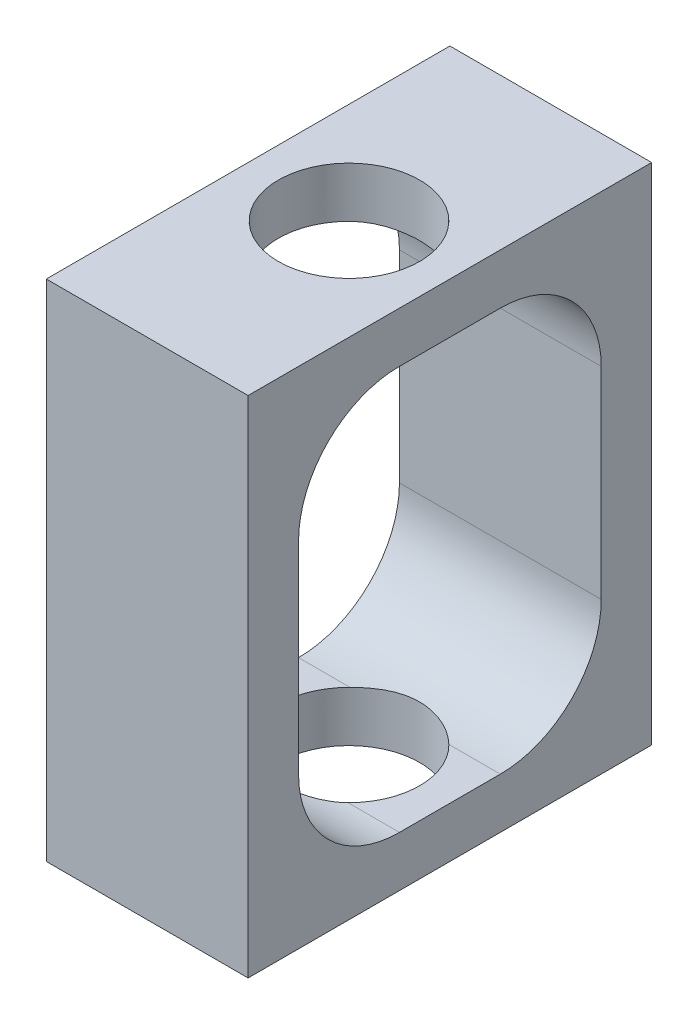
ISO-10303-21;
HEADER;
FILE_DESCRIPTION(('STEP AP214'),'2;1');
FILE_NAME('part.step','',(''),(''),'','','');
FILE_SCHEMA(('AUTOMOTIVE_DESIGN { 1 0 10303 214 1 1 1 1 }'));
ENDSEC;
DATA;
#1=APPLICATION_CONTEXT('core data for automotive mechanical design processes');
#2=APPLICATION_PROTOCOL_DEFINITION('international standard','automotive_design',2000,#1);
#3=PRODUCT_CONTEXT('',#1,'mechanical');
#4=PRODUCT('Part','Part','',(#3));
#5=PRODUCT_RELATED_PRODUCT_CATEGORY('part','',(#4));
#6=PRODUCT_DEFINITION_FORMATION('','',#4);
#7=PRODUCT_DEFINITION_CONTEXT('part definition',#1,'design');
#8=PRODUCT_DEFINITION('design','',#6,#7);
#9=PRODUCT_DEFINITION_SHAPE('','',#8);
#10=(LENGTH_UNIT() NAMED_UNIT(*) SI_UNIT(.MILLI.,.METRE.));
#11=(NAMED_UNIT(*) PLANE_ANGLE_UNIT() SI_UNIT($,.RADIAN.));
#12=(NAMED_UNIT(*) SI_UNIT($,.STERADIAN.) SOLID_ANGLE_UNIT());
#13=UNCERTAINTY_MEASURE_WITH_UNIT(LENGTH_MEASURE(1.E-05),#10,'distance_accuracy_value','');
#14=(GEOMETRIC_REPRESENTATION_CONTEXT(3) GLOBAL_UNCERTAINTY_ASSIGNED_CONTEXT((#13)) GLOBAL_UNIT_ASSIGNED_CONTEXT((#10,
#11,#12)) REPRESENTATION_CONTEXT('',''));
#15=CARTESIAN_POINT('',(0.,0.,0.));
#16=DIRECTION('',(0.,0.,1.));
#17=DIRECTION('',(1.,0.,0.));
#18=AXIS2_PLACEMENT_3D('',#15,#16,#17);
#19=CARTESIAN_POINT('',(10.,-20.,5.00000000000001));
#20=DIRECTION('',(0.,1.,0.));
#21=DIRECTION('',(0.,0.,1.));
#22=AXIS2_PLACEMENT_3D('',#19,#20,#21);
#23=PLANE('',#22);
#24=CARTESIAN_POINT('',(0.,-20.,0.));
#25=DIRECTION('',(0.,1.,0.));
#26=DIRECTION('',(0.,0.,1.));
#27=AXIS2_PLACEMENT_3D('',#24,#25,#26);
#28=CIRCLE('',#27,7.);
#29=CARTESIAN_POINT('',(4.89897948556635,-20.,5.00000000000001));
#30=VERTEX_POINT('',#29);
#31=CARTESIAN_POINT('',(4.89897948556635,-20.,-5.00000000000001));
#32=VERTEX_POINT('',#31);
#33=EDGE_CURVE('E54',#30,#32,#28,.T.);
#34=ORIENTED_EDGE('',*,*,#33,.F.);
#35=DIRECTION('',(-1.,0.,0.));
#36=VECTOR('',#35,1.);
#37=CARTESIAN_POINT('',(10.,-20.,5.00000000000001));
#38=LINE('',#37,#36);
#39=CARTESIAN_POINT('',(10.,-20.,5.00000000000001));
#40=VERTEX_POINT('',#39);
#41=EDGE_CURVE('E187',#40,#30,#38,.T.);
#42=ORIENTED_EDGE('',*,*,#41,.F.);
#43=DIRECTION('',(0.,0.,-1.));
#44=VECTOR('',#43,1.);
#45=CARTESIAN_POINT('',(10.,-20.,5.00000000000001));
#46=LINE('',#45,#44);
#47=CARTESIAN_POINT('',(10.,-20.,-5.00000000000001));
#48=VERTEX_POINT('',#47);
#49=EDGE_CURVE('E260',#40,#48,#46,.T.);
#50=ORIENTED_EDGE('',*,*,#49,.T.);
#51=DIRECTION('',(-1.,0.,0.));
#52=VECTOR('',#51,1.);
#53=CARTESIAN_POINT('',(10.,-20.,-5.00000000000001));
#54=LINE('',#53,#52);
#55=EDGE_CURVE('E183',#48,#32,#54,.T.);
#56=ORIENTED_EDGE('',*,*,#55,.T.);
#57=EDGE_LOOP('',(#34,#42,#50,#56));
#58=FACE_BOUND('',#57,.T.);
#59=ADVANCED_FACE('F39',(#58),#23,.T.);
#60=CARTESIAN_POINT('',(10.,20.,5.00000000000001));
#61=DIRECTION('',(0.,-1.,0.));
#62=DIRECTION('',(0.,0.,-1.));
#63=AXIS2_PLACEMENT_3D('',#60,#61,#62);
#64=PLANE('',#63);
#65=CARTESIAN_POINT('',(0.,20.,0.));
#66=DIRECTION('',(0.,-1.,0.));
#67=DIRECTION('',(0.,0.,-1.));
#68=AXIS2_PLACEMENT_3D('',#65,#66,#67);
#69=CIRCLE('',#68,7.);
#70=CARTESIAN_POINT('',(4.89897948556635,20.,-5.00000000000001));
#71=VERTEX_POINT('',#70);
#72=CARTESIAN_POINT('',(4.89897948556635,20.,5.00000000000001));
#73=VERTEX_POINT('',#72);
#74=EDGE_CURVE('E11',#71,#73,#69,.T.);
#75=ORIENTED_EDGE('',*,*,#74,.F.);
#76=DIRECTION('',(-1.,0.,0.));
#77=VECTOR('',#76,1.);
#78=CARTESIAN_POINT('',(10.,20.,-5.00000000000001));
#79=LINE('',#78,#77);
#80=CARTESIAN_POINT('',(10.,20.,-5.00000000000001));
#81=VERTEX_POINT('',#80);
#82=EDGE_CURVE('E164',#81,#71,#79,.T.);
#83=ORIENTED_EDGE('',*,*,#82,.F.);
#84=DIRECTION('',(0.,0.,1.));
#85=VECTOR('',#84,1.);
#86=CARTESIAN_POINT('',(10.,20.,5.00000000000001));
#87=LINE('',#86,#85);
#88=CARTESIAN_POINT('',(10.,20.,5.00000000000001));
#89=VERTEX_POINT('',#88);
#90=EDGE_CURVE('E272',#81,#89,#87,.T.);
#91=ORIENTED_EDGE('',*,*,#90,.T.);
#92=DIRECTION('',(-1.,0.,0.));
#93=VECTOR('',#92,1.);
#94=CARTESIAN_POINT('',(10.,20.,5.00000000000001));
#95=LINE('',#94,#93);
#96=EDGE_CURVE('E171',#89,#73,#95,.T.);
#97=ORIENTED_EDGE('',*,*,#96,.T.);
#98=EDGE_LOOP('',(#75,#83,#91,#97));
#99=FACE_BOUND('',#98,.T.);
#100=ADVANCED_FACE('F246',(#99),#64,.T.);
#101=CARTESIAN_POINT('',(10.,0.,0.));
#102=DIRECTION('',(1.,0.,0.));
#103=DIRECTION('',(0.,0.,-1.));
#104=AXIS2_PLACEMENT_3D('',#101,#102,#103);
#105=PLANE('',#104);
#106=DIRECTION('',(0.,1.,0.));
#107=VECTOR('',#106,1.);
#108=CARTESIAN_POINT('',(10.,25.,-20.));
#109=LINE('',#108,#107);
#110=CARTESIAN_POINT('',(10.,-25.,-20.));
#111=VERTEX_POINT('',#110);
#112=CARTESIAN_POINT('',(10.,25.,-20.));
#113=VERTEX_POINT('',#112);
#114=EDGE_CURVE('E196',#111,#113,#109,.T.);
#115=ORIENTED_EDGE('',*,*,#114,.T.);
#116=DIRECTION('',(0.,0.,1.));
#117=VECTOR('',#116,1.);
#118=CARTESIAN_POINT('',(10.,25.,20.));
#119=LINE('',#118,#117);
#120=CARTESIAN_POINT('',(10.,25.,20.));
#121=VERTEX_POINT('',#120);
#122=EDGE_CURVE('E199',#113,#121,#119,.T.);
#123=ORIENTED_EDGE('',*,*,#122,.T.);
#124=DIRECTION('',(0.,-1.,0.));
#125=VECTOR('',#124,1.);
#126=CARTESIAN_POINT('',(10.,25.,20.));
#127=LINE('',#126,#125);
#128=CARTESIAN_POINT('',(10.,-25.,20.));
#129=VERTEX_POINT('',#128);
#130=EDGE_CURVE('E202',#121,#129,#127,.T.);
#131=ORIENTED_EDGE('',*,*,#130,.T.);
#132=DIRECTION('',(0.,0.,-1.));
#133=VECTOR('',#132,1.);
#134=CARTESIAN_POINT('',(10.,-25.,20.));
#135=LINE('',#134,#133);
#136=EDGE_CURVE('E204',#129,#111,#135,.T.);
#137=ORIENTED_EDGE('',*,*,#136,.T.);
#138=EDGE_LOOP('',(#115,#123,#131,#137));
#139=FACE_BOUND('',#138,.T.);
#140=DIRECTION('',(0.,-1.,0.));
#141=VECTOR('',#140,1.);
#142=CARTESIAN_POINT('',(10.,9.99999999999999,15.));
#143=LINE('',#142,#141);
#144=CARTESIAN_POINT('',(10.,9.99999999999999,15.));
#145=VERTEX_POINT('',#144);
#146=CARTESIAN_POINT('',(10.,-10.,15.));
#147=VERTEX_POINT('',#146);
#148=EDGE_CURVE('E251',#145,#147,#143,.T.);
#149=ORIENTED_EDGE('',*,*,#148,.F.);
#150=CARTESIAN_POINT('',(10.,9.99999999999999,5.00000000000001));
#151=DIRECTION('',(1.,0.,0.));
#152=DIRECTION('',(0.,0.,-1.));
#153=AXIS2_PLACEMENT_3D('',#150,#151,#152);
#154=CIRCLE('',#153,10.);
#155=EDGE_CURVE('E253',#89,#145,#154,.T.);
#156=ORIENTED_EDGE('',*,*,#155,.F.);
#157=ORIENTED_EDGE('',*,*,#90,.F.);
#158=CARTESIAN_POINT('',(10.,9.99999999999999,-5.00000000000001));
#159=DIRECTION('',(1.,0.,0.));
#160=DIRECTION('',(0.,0.,1.));
#161=AXIS2_PLACEMENT_3D('',#158,#159,#160);
#162=CIRCLE('',#161,10.);
#163=CARTESIAN_POINT('',(10.,9.99999999999999,-15.));
#164=VERTEX_POINT('',#163);
#165=EDGE_CURVE('E270',#164,#81,#162,.T.);
#166=ORIENTED_EDGE('',*,*,#165,.F.);
#167=DIRECTION('',(0.,1.,0.));
#168=VECTOR('',#167,1.);
#169=CARTESIAN_POINT('',(10.,9.99999999999999,-15.));
#170=LINE('',#169,#168);
#171=CARTESIAN_POINT('',(10.,-10.,-15.));
#172=VERTEX_POINT('',#171);
#173=EDGE_CURVE('E268',#172,#164,#170,.T.);
#174=ORIENTED_EDGE('',*,*,#173,.F.);
#175=CARTESIAN_POINT('',(10.,-10.,-5.00000000000001));
#176=DIRECTION('',(1.,0.,0.));
#177=DIRECTION('',(0.,0.,-1.));
#178=AXIS2_PLACEMENT_3D('',#175,#176,#177);
#179=CIRCLE('',#178,10.);
#180=EDGE_CURVE('E266',#48,#172,#179,.T.);
#181=ORIENTED_EDGE('',*,*,#180,.F.);
#182=ORIENTED_EDGE('',*,*,#49,.F.);
#183=CARTESIAN_POINT('',(10.,-10.,5.00000000000001));
#184=DIRECTION('',(1.,0.,0.));
#185=DIRECTION('',(0.,0.,-1.));
#186=AXIS2_PLACEMENT_3D('',#183,#184,#185);
#187=CIRCLE('',#186,10.);
#188=EDGE_CURVE('E255',#147,#40,#187,.T.);
#189=ORIENTED_EDGE('',*,*,#188,.F.);
#190=EDGE_LOOP('',(#149,#156,#157,#166,#174,#181,#182,#189));
#191=FACE_BOUND('',#190,.T.);
#192=ADVANCED_FACE('F243',(#139,#191),#105,.T.);
#193=CARTESIAN_POINT('',(-10.,0.,0.));
#194=DIRECTION('',(1.,0.,0.));
#195=DIRECTION('',(0.,0.,-1.));
#196=AXIS2_PLACEMENT_3D('',#193,#194,#195);
#197=PLANE('',#196);
#198=DIRECTION('',(0.,1.,0.));
#199=VECTOR('',#198,1.);
#200=CARTESIAN_POINT('',(-10.,25.,-20.));
#201=LINE('',#200,#199);
#202=CARTESIAN_POINT('',(-10.,-25.,-20.));
#203=VERTEX_POINT('',#202);
#204=CARTESIAN_POINT('',(-10.,25.,-20.));
#205=VERTEX_POINT('',#204);
#206=EDGE_CURVE('E195',#203,#205,#201,.T.);
#207=ORIENTED_EDGE('',*,*,#206,.F.);
#208=DIRECTION('',(0.,0.,-1.));
#209=VECTOR('',#208,1.);
#210=CARTESIAN_POINT('',(-10.,-25.,20.));
#211=LINE('',#210,#209);
#212=CARTESIAN_POINT('',(-10.,-25.,20.));
#213=VERTEX_POINT('',#212);
#214=EDGE_CURVE('E200',#213,#203,#211,.T.);
#215=ORIENTED_EDGE('',*,*,#214,.F.);
#216=DIRECTION('',(0.,-1.,0.));
#217=VECTOR('',#216,1.);
#218=CARTESIAN_POINT('',(-10.,25.,20.));
#219=LINE('',#218,#217);
#220=CARTESIAN_POINT('',(-10.,25.,20.));
#221=VERTEX_POINT('',#220);
#222=EDGE_CURVE('E211',#221,#213,#219,.T.);
#223=ORIENTED_EDGE('',*,*,#222,.F.);
#224=DIRECTION('',(0.,0.,1.));
#225=VECTOR('',#224,1.);
#226=CARTESIAN_POINT('',(-10.,25.,20.));
#227=LINE('',#226,#225);
#228=EDGE_CURVE('E209',#205,#221,#227,.T.);
#229=ORIENTED_EDGE('',*,*,#228,.F.);
#230=EDGE_LOOP('',(#207,#215,#223,#229));
#231=FACE_BOUND('',#230,.T.);
#232=CARTESIAN_POINT('',(-10.,9.99999999999999,5.00000000000001));
#233=DIRECTION('',(1.,0.,0.));
#234=DIRECTION('',(0.,0.,-1.));
#235=AXIS2_PLACEMENT_3D('',#232,#233,#234);
#236=CIRCLE('',#235,10.);
#237=CARTESIAN_POINT('',(-10.,20.,5.00000000000001));
#238=VERTEX_POINT('',#237);
#239=CARTESIAN_POINT('',(-10.,9.99999999999999,15.));
#240=VERTEX_POINT('',#239);
#241=EDGE_CURVE('E274',#238,#240,#236,.T.);
#242=ORIENTED_EDGE('',*,*,#241,.T.);
#243=DIRECTION('',(0.,-1.,0.));
#244=VECTOR('',#243,1.);
#245=CARTESIAN_POINT('',(-10.,9.99999999999999,15.));
#246=LINE('',#245,#244);
#247=CARTESIAN_POINT('',(-10.,-10.,15.));
#248=VERTEX_POINT('',#247);
#249=EDGE_CURVE('E277',#240,#248,#246,.T.);
#250=ORIENTED_EDGE('',*,*,#249,.T.);
#251=CARTESIAN_POINT('',(-10.,-10.,5.00000000000001));
#252=DIRECTION('',(1.,0.,0.));
#253=DIRECTION('',(0.,0.,-1.));
#254=AXIS2_PLACEMENT_3D('',#251,#252,#253);
#255=CIRCLE('',#254,10.);
#256=CARTESIAN_POINT('',(-10.,-20.,5.00000000000001));
#257=VERTEX_POINT('',#256);
#258=EDGE_CURVE('E281',#248,#257,#255,.T.);
#259=ORIENTED_EDGE('',*,*,#258,.T.);
#260=DIRECTION('',(0.,0.,-1.));
#261=VECTOR('',#260,1.);
#262=CARTESIAN_POINT('',(-10.,-20.,5.00000000000001));
#263=LINE('',#262,#261);
#264=CARTESIAN_POINT('',(-10.,-20.,-5.00000000000001));
#265=VERTEX_POINT('',#264);
#266=EDGE_CURVE('E284',#257,#265,#263,.T.);
#267=ORIENTED_EDGE('',*,*,#266,.T.);
#268=CARTESIAN_POINT('',(-10.,-10.,-5.00000000000001));
#269=DIRECTION('',(1.,0.,0.));
#270=DIRECTION('',(0.,0.,-1.));
#271=AXIS2_PLACEMENT_3D('',#268,#269,#270);
#272=CIRCLE('',#271,10.);
#273=CARTESIAN_POINT('',(-10.,-10.,-15.));
#274=VERTEX_POINT('',#273);
#275=EDGE_CURVE('E287',#265,#274,#272,.T.);
#276=ORIENTED_EDGE('',*,*,#275,.T.);
#277=DIRECTION('',(0.,1.,0.));
#278=VECTOR('',#277,1.);
#279=CARTESIAN_POINT('',(-10.,9.99999999999999,-15.));
#280=LINE('',#279,#278);
#281=CARTESIAN_POINT('',(-10.,9.99999999999999,-15.));
#282=VERTEX_POINT('',#281);
#283=EDGE_CURVE('E290',#274,#282,#280,.T.);
#284=ORIENTED_EDGE('',*,*,#283,.T.);
#285=CARTESIAN_POINT('',(-10.,9.99999999999999,-5.00000000000001));
#286=DIRECTION('',(1.,0.,0.));
#287=DIRECTION('',(0.,0.,1.));
#288=AXIS2_PLACEMENT_3D('',#285,#286,#287);
#289=CIRCLE('',#288,10.);
#290=CARTESIAN_POINT('',(-10.,20.,-5.00000000000001));
#291=VERTEX_POINT('',#290);
#292=EDGE_CURVE('E293',#282,#291,#289,.T.);
#293=ORIENTED_EDGE('',*,*,#292,.T.);
#294=DIRECTION('',(0.,0.,1.));
#295=VECTOR('',#294,1.);
#296=CARTESIAN_POINT('',(-10.,20.,5.00000000000001));
#297=LINE('',#296,#295);
#298=EDGE_CURVE('E169',#291,#238,#297,.T.);
#299=ORIENTED_EDGE('',*,*,#298,.T.);
#300=EDGE_LOOP('',(#242,#250,#259,#267,#276,#284,#293,#299));
#301=FACE_BOUND('',#300,.T.);
#302=ADVANCED_FACE('F232',(#231,#301),#197,.F.);
#303=CARTESIAN_POINT('',(10.,25.,-20.));
#304=DIRECTION('',(0.,0.,1.));
#305=DIRECTION('',(1.,0.,0.));
#306=AXIS2_PLACEMENT_3D('',#303,#304,#305);
#307=PLANE('',#306);
#308=ORIENTED_EDGE('',*,*,#206,.T.);
#309=DIRECTION('',(-1.,0.,0.));
#310=VECTOR('',#309,1.);
#311=CARTESIAN_POINT('',(10.,25.,-20.));
#312=LINE('',#311,#310);
#313=EDGE_CURVE('E156',#113,#205,#312,.T.);
#314=ORIENTED_EDGE('',*,*,#313,.F.);
#315=ORIENTED_EDGE('',*,*,#114,.F.);
#316=DIRECTION('',(-1.,0.,0.));
#317=VECTOR('',#316,1.);
#318=CARTESIAN_POINT('',(10.,-25.,-20.));
#319=LINE('',#318,#317);
#320=EDGE_CURVE('E206',#111,#203,#319,.T.);
#321=ORIENTED_EDGE('',*,*,#320,.T.);
#322=EDGE_LOOP('',(#308,#314,#315,#321));
#323=FACE_BOUND('',#322,.T.);
#324=ADVANCED_FACE('F41',(#323),#307,.F.);
#325=CARTESIAN_POINT('',(10.,25.,20.));
#326=DIRECTION('',(0.,-1.,0.));
#327=DIRECTION('',(0.,0.,-1.));
#328=AXIS2_PLACEMENT_3D('',#325,#326,#327);
#329=PLANE('',#328);
#330=CARTESIAN_POINT('',(0.,25.,0.));
#331=DIRECTION('',(0.,1.,0.));
#332=DIRECTION('',(0.,0.,1.));
#333=AXIS2_PLACEMENT_3D('',#330,#331,#332);
#334=CIRCLE('',#333,7.);
#335=CARTESIAN_POINT('',(0.,25.,7.));
#336=VERTEX_POINT('',#335);
#337=EDGE_CURVE('E496',#336,#336,#334,.T.);
#338=ORIENTED_EDGE('',*,*,#337,.F.);
#339=EDGE_LOOP('',(#338));
#340=FACE_BOUND('',#339,.T.);
#341=ORIENTED_EDGE('',*,*,#228,.T.);
#342=DIRECTION('',(-1.,0.,0.));
#343=VECTOR('',#342,1.);
#344=CARTESIAN_POINT('',(10.,25.,20.));
#345=LINE('',#344,#343);
#346=EDGE_CURVE('E219',#121,#221,#345,.T.);
#347=ORIENTED_EDGE('',*,*,#346,.F.);
#348=ORIENTED_EDGE('',*,*,#122,.F.);
#349=ORIENTED_EDGE('',*,*,#313,.T.);
#350=EDGE_LOOP('',(#341,#347,#348,#349));
#351=FACE_BOUND('',#350,.T.);
#352=ADVANCED_FACE('F224',(#340,#351),#329,.F.);
#353=CARTESIAN_POINT('',(10.,25.,20.));
#354=DIRECTION('',(0.,0.,-1.));
#355=DIRECTION('',(-1.,0.,0.));
#356=AXIS2_PLACEMENT_3D('',#353,#354,#355);
#357=PLANE('',#356);
#358=ORIENTED_EDGE('',*,*,#222,.T.);
#359=DIRECTION('',(-1.,0.,0.));
#360=VECTOR('',#359,1.);
#361=CARTESIAN_POINT('',(10.,-25.,20.));
#362=LINE('',#361,#360);
#363=EDGE_CURVE('E216',#129,#213,#362,.T.);
#364=ORIENTED_EDGE('',*,*,#363,.F.);
#365=ORIENTED_EDGE('',*,*,#130,.F.);
#366=ORIENTED_EDGE('',*,*,#346,.T.);
#367=EDGE_LOOP('',(#358,#364,#365,#366));
#368=FACE_BOUND('',#367,.T.);
#369=ADVANCED_FACE('F237',(#368),#357,.F.);
#370=CARTESIAN_POINT('',(10.,-25.,20.));
#371=DIRECTION('',(0.,1.,0.));
#372=DIRECTION('',(0.,0.,1.));
#373=AXIS2_PLACEMENT_3D('',#370,#371,#372);
#374=PLANE('',#373);
#375=CARTESIAN_POINT('',(0.,-25.,0.));
#376=DIRECTION('',(0.,1.,0.));
#377=DIRECTION('',(0.,0.,1.));
#378=AXIS2_PLACEMENT_3D('',#375,#376,#377);
#379=CIRCLE('',#378,7.);
#380=CARTESIAN_POINT('',(0.,-25.,7.));
#381=VERTEX_POINT('',#380);
#382=EDGE_CURVE('E165',#381,#381,#379,.T.);
#383=ORIENTED_EDGE('',*,*,#382,.T.);
#384=EDGE_LOOP('',(#383));
#385=FACE_BOUND('',#384,.T.);
#386=ORIENTED_EDGE('',*,*,#214,.T.);
#387=ORIENTED_EDGE('',*,*,#320,.F.);
#388=ORIENTED_EDGE('',*,*,#136,.F.);
#389=ORIENTED_EDGE('',*,*,#363,.T.);
#390=EDGE_LOOP('',(#386,#387,#388,#389));
#391=FACE_BOUND('',#390,.T.);
#392=ADVANCED_FACE('F241',(#385,#391),#374,.F.);
#393=CARTESIAN_POINT('',(10.,9.99999999999999,5.00000000000001));
#394=DIRECTION('',(-1.,0.,0.));
#395=DIRECTION('',(0.,0.,1.));
#396=AXIS2_PLACEMENT_3D('',#393,#394,#395);
#397=CYLINDRICAL_SURFACE('',#396,10.);
#398=CARTESIAN_POINT('',(4.89897948556635,20.,5.00000000000001));
#399=CARTESIAN_POINT('',(4.75906144843106,19.99999564988,5.1371228849399));
#400=CARTESIAN_POINT('',(4.61338560174563,19.997179190797,5.26831139777291));
#401=CARTESIAN_POINT('',(4.31169068672161,19.9873604279464,5.51793045499645));
#402=CARTESIAN_POINT('',(4.15567504744615,19.9803595057886,5.63636519515231));
#403=CARTESIAN_POINT('',(3.83444919495901,19.9636119442593,5.8596303935024));
#404=CARTESIAN_POINT('',(3.66924302224488,19.9538665039427,5.96446676355123));
#405=CARTESIAN_POINT('',(3.33069652724321,19.9329875656152,6.15992379032135));
#406=CARTESIAN_POINT('',(3.15735565596276,19.9218539738368,6.25054348579296));
#407=CARTESIAN_POINT('',(2.80376648519738,19.8994617260947,6.41693545917038));
#408=CARTESIAN_POINT('',(2.62352046521201,19.8882031122597,6.49271258720027));
#409=CARTESIAN_POINT('',(2.25727121615959,19.8666762832176,6.62894403698854));
#410=CARTESIAN_POINT('',(2.07126806434578,19.8564080547285,6.68939856425645));
#411=CARTESIAN_POINT('',(1.69484515057814,19.8378100258575,6.7945322891914));
#412=CARTESIAN_POINT('',(1.50442734505007,19.8294793842008,6.83921833770073));
#413=CARTESIAN_POINT('',(1.12042405324723,19.8154818263267,6.91251446718161));
#414=CARTESIAN_POINT('',(0.926838584911666,19.8098148950296,6.94112463916217));
#415=CARTESIAN_POINT('',(0.537454704692252,19.8016206456619,6.98208782577597));
#416=CARTESIAN_POINT('',(0.341652353236317,19.7991002808995,6.99440483921785));
#417=CARTESIAN_POINT('',(-0.0503114344762466,19.797436268489,7.00256342069674));
#418=CARTESIAN_POINT('',(-0.246472873343679,19.7982926454902,6.9984048684661));
#419=CARTESIAN_POINT('',(-0.637783649184534,19.8033104677283,6.97364188238686));
#420=CARTESIAN_POINT('',(-0.832932585943366,19.8074731325314,6.9530313800134));
#421=CARTESIAN_POINT('',(-1.22072326670553,19.8187495882788,6.89552441612888));
#422=CARTESIAN_POINT('',(-1.41336506021876,19.8258633208552,6.85862827672293));
#423=CARTESIAN_POINT('',(-1.79217631701503,19.8423102121072,6.76944978183305));
#424=CARTESIAN_POINT('',(-1.9783982077305,19.8516118024561,6.7173839676316));
#425=CARTESIAN_POINT('',(-2.34583652108035,19.871669992267,6.59805797061007));
#426=CARTESIAN_POINT('',(-2.52705264283568,19.8824266789617,6.53079687667614));
#427=CARTESIAN_POINT('',(-2.88316369111359,19.9043881809011,6.38158320011455));
#428=CARTESIAN_POINT('',(-3.0580628543198,19.9155926847634,6.29964069250342));
#429=CARTESIAN_POINT('',(-3.40046815794824,19.9373054146031,6.12160631232607));
#430=CARTESIAN_POINT('',(-3.56797608584314,19.9478138092368,6.02551788540997));
#431=CARTESIAN_POINT('',(-3.94150438064145,19.9696185849698,5.79018104329629));
#432=CARTESIAN_POINT('',(-4.14478352726645,19.9802758406701,5.64645975953044));
#433=CARTESIAN_POINT('',(-4.4372893134706,19.9916681414418,5.41534112816267));
#434=CARTESIAN_POINT('',(-4.53269204248663,19.9946997266151,5.33574188165284));
#435=CARTESIAN_POINT('',(-4.71915365701482,19.9988654085679,5.17155801661657));
#436=CARTESIAN_POINT('',(-4.81021241765271,19.9999994508315,5.08697325492965));
#437=CARTESIAN_POINT('',(-4.89897948556635,20.,5.00000000000001));
#438=B_SPLINE_CURVE_WITH_KNOTS('',3,(#398,#399,#400,#401,#402,#403,#404,#405,#406,#407,#408,
#409,#410,#411,#412,#413,#414,#415,#416,#417,#418,#419,#420,#421,#422,#423,#424,#425,#426,#427,
#428,#429,#430,#431,#432,#433,#434,#435,#436,#437),.UNSPECIFIED.,.F.,.F.,(4,2,2,2,2,2,2,2,2,2,2,
2,2,2,2,2,2,2,2,4),(0.,0.587471530871945,1.17474919974625,1.76177068933847,2.34883185285334,
2.9357008604523,3.52256199643987,4.10916784733234,4.6957703772887,5.28366690490185,
5.87156772402522,6.45968549860084,7.04779164162328,7.62788287713043,8.20800890433029,
8.78773833841841,9.36732679546515,10.1132252552326,10.4859207388046,10.8586269296513),.UNSPECIFIED.);
#439=CARTESIAN_POINT('',(-4.89897948556635,20.,5.00000000000001));
#440=VERTEX_POINT('',#439);
#441=EDGE_CURVE('E61',#73,#440,#438,.T.);
#442=ORIENTED_EDGE('',*,*,#441,.F.);
#443=ORIENTED_EDGE('',*,*,#96,.F.);
#444=ORIENTED_EDGE('',*,*,#155,.T.);
#445=DIRECTION('',(-1.,0.,0.));
#446=VECTOR('',#445,1.);
#447=CARTESIAN_POINT('',(10.,9.99999999999999,15.));
#448=LINE('',#447,#446);
#449=EDGE_CURVE('E192',#145,#240,#448,.T.);
#450=ORIENTED_EDGE('',*,*,#449,.T.);
#451=ORIENTED_EDGE('',*,*,#241,.F.);
#452=EDGE_CURVE('E175',#440,#238,#95,.T.);
#453=ORIENTED_EDGE('',*,*,#452,.F.);
#454=EDGE_LOOP('',(#442,#443,#444,#450,#451,#453));
#455=FACE_BOUND('',#454,.T.);
#456=ADVANCED_FACE('F304',(#455),#397,.F.);
#457=CARTESIAN_POINT('',(10.,9.99999999999999,15.));
#458=DIRECTION('',(0.,0.,-1.));
#459=DIRECTION('',(-1.,0.,0.));
#460=AXIS2_PLACEMENT_3D('',#457,#458,#459);
#461=PLANE('',#460);
#462=ORIENTED_EDGE('',*,*,#249,.F.);
#463=ORIENTED_EDGE('',*,*,#449,.F.);
#464=ORIENTED_EDGE('',*,*,#148,.T.);
#465=DIRECTION('',(-1.,0.,0.));
#466=VECTOR('',#465,1.);
#467=CARTESIAN_POINT('',(10.,-10.,15.));
#468=LINE('',#467,#466);
#469=EDGE_CURVE('E190',#147,#248,#468,.T.);
#470=ORIENTED_EDGE('',*,*,#469,.T.);
#471=EDGE_LOOP('',(#462,#463,#464,#470));
#472=FACE_BOUND('',#471,.T.);
#473=ADVANCED_FACE('F346',(#472),#461,.T.);
#474=CARTESIAN_POINT('',(10.,-10.,5.00000000000001));
#475=DIRECTION('',(-1.,0.,0.));
#476=DIRECTION('',(0.,0.,1.));
#477=AXIS2_PLACEMENT_3D('',#474,#475,#476);
#478=CYLINDRICAL_SURFACE('',#477,10.);
#479=CARTESIAN_POINT('',(-4.89897948556635,-20.,5.));
#480=CARTESIAN_POINT('',(-4.75906144843106,-19.99999564988,5.13712288493989));
#481=CARTESIAN_POINT('',(-4.61338560174563,-19.997179190797,5.26831139777291));
#482=CARTESIAN_POINT('',(-4.31169068672161,-19.9873604279464,5.51793045499645));
#483=CARTESIAN_POINT('',(-4.15567504744615,-19.9803595057886,5.63636519515231));
#484=CARTESIAN_POINT('',(-3.83444919495902,-19.9636119442593,5.85963039350239));
#485=CARTESIAN_POINT('',(-3.66924302224488,-19.9538665039427,5.96446676355122));
#486=CARTESIAN_POINT('',(-3.33069652724322,-19.9329875656152,6.15992379032135));
#487=CARTESIAN_POINT('',(-3.15735565596277,-19.9218539738368,6.25054348579296));
#488=CARTESIAN_POINT('',(-2.80376648519738,-19.8994617260947,6.41693545917038));
#489=CARTESIAN_POINT('',(-2.62352046521202,-19.8882031122597,6.49271258720027));
#490=CARTESIAN_POINT('',(-2.25727121615959,-19.8666762832176,6.62894403698854));
#491=CARTESIAN_POINT('',(-2.07126806434579,-19.8564080547285,6.68939856425645));
#492=CARTESIAN_POINT('',(-1.69484515057815,-19.8378100258575,6.7945322891914));
#493=CARTESIAN_POINT('',(-1.50442734505008,-19.8294793842008,6.83921833770073));
#494=CARTESIAN_POINT('',(-1.12042405324724,-19.8154818263267,6.91251446718161));
#495=CARTESIAN_POINT('',(-0.926838584911671,-19.8098148950296,6.94112463916217));
#496=CARTESIAN_POINT('',(-0.537454704692257,-19.8016206456619,6.98208782577597));
#497=CARTESIAN_POINT('',(-0.341652353236323,-19.7991002808995,6.99440483921785));
#498=CARTESIAN_POINT('',(0.050311434476241,-19.797436268489,7.00256342069674));
#499=CARTESIAN_POINT('',(0.246472873343673,-19.7982926454902,6.9984048684661));
#500=CARTESIAN_POINT('',(0.637783649184529,-19.8033104677283,6.97364188238687));
#501=CARTESIAN_POINT('',(0.832932585943361,-19.8074731325314,6.9530313800134));
#502=CARTESIAN_POINT('',(1.22072326670552,-19.8187495882788,6.89552441612888));
#503=CARTESIAN_POINT('',(1.41336506021875,-19.8258633208552,6.85862827672293));
#504=CARTESIAN_POINT('',(1.79217631701502,-19.8423102121072,6.76944978183305));
#505=CARTESIAN_POINT('',(1.9783982077305,-19.8516118024561,6.7173839676316));
#506=CARTESIAN_POINT('',(2.34583652108034,-19.871669992267,6.59805797061007));
#507=CARTESIAN_POINT('',(2.52705264283568,-19.8824266789617,6.53079687667614));
#508=CARTESIAN_POINT('',(2.88316369111358,-19.9043881809011,6.38158320011456));
#509=CARTESIAN_POINT('',(3.05806285431979,-19.9155926847634,6.29964069250342));
#510=CARTESIAN_POINT('',(3.40046815794824,-19.9373054146031,6.12160631232607));
#511=CARTESIAN_POINT('',(3.56797608584314,-19.9478138092368,6.02551788540997));
#512=CARTESIAN_POINT('',(3.94150438064145,-19.9696185849698,5.7901810432963));
#513=CARTESIAN_POINT('',(4.14478352726644,-19.9802758406701,5.64645975953044));
#514=CARTESIAN_POINT('',(4.4372893134706,-19.9916681414418,5.41534112816267));
#515=CARTESIAN_POINT('',(4.53269204248663,-19.9946997266151,5.33574188165284));
#516=CARTESIAN_POINT('',(4.71915365701482,-19.9988654085679,5.17155801661657));
#517=CARTESIAN_POINT('',(4.81021241765272,-19.9999994508315,5.08697325492965));
#518=CARTESIAN_POINT('',(4.89897948556635,-20.,5.));
#519=B_SPLINE_CURVE_WITH_KNOTS('',3,(#479,#480,#481,#482,#483,#484,#485,#486,#487,#488,#489,
#490,#491,#492,#493,#494,#495,#496,#497,#498,#499,#500,#501,#502,#503,#504,#505,#506,#507,#508,
#509,#510,#511,#512,#513,#514,#515,#516,#517,#518),.UNSPECIFIED.,.F.,.F.,(4,2,2,2,2,2,2,2,2,2,2,
2,2,2,2,2,2,2,2,4),(0.,0.587471530871945,1.17474919974625,1.76177068933847,2.34883185285333,
2.9357008604523,3.52256199643987,4.10916784733234,4.69577037728869,5.28366690490184,
5.87156772402522,6.45968549860084,7.04779164162327,7.62788287713042,8.20800890433028,
8.7877383384184,9.36732679546515,10.1132252552326,10.4859207388046,10.8586269296513),.UNSPECIFIED.);
#520=CARTESIAN_POINT('',(-4.89897948556635,-20.,5.00000000000001));
#521=VERTEX_POINT('',#520);
#522=EDGE_CURVE('E278',#521,#30,#519,.T.);
#523=ORIENTED_EDGE('',*,*,#522,.F.);
#524=EDGE_CURVE('E186',#521,#257,#38,.T.);
#525=ORIENTED_EDGE('',*,*,#524,.T.);
#526=ORIENTED_EDGE('',*,*,#258,.F.);
#527=ORIENTED_EDGE('',*,*,#469,.F.);
#528=ORIENTED_EDGE('',*,*,#188,.T.);
#529=ORIENTED_EDGE('',*,*,#41,.T.);
#530=EDGE_LOOP('',(#523,#525,#526,#527,#528,#529));
#531=FACE_BOUND('',#530,.T.);
#532=ADVANCED_FACE('F341',(#531),#478,.F.);
#533=CARTESIAN_POINT('',(-4.89897948556635,-20.,-5.00000000000001));
#534=VERTEX_POINT('',#533);
#535=EDGE_CURVE('E307',#534,#521,#28,.T.);
#536=ORIENTED_EDGE('',*,*,#535,.F.);
#537=EDGE_CURVE('E182',#534,#265,#54,.T.);
#538=ORIENTED_EDGE('',*,*,#537,.T.);
#539=ORIENTED_EDGE('',*,*,#266,.F.);
#540=ORIENTED_EDGE('',*,*,#524,.F.);
#541=EDGE_LOOP('',(#536,#538,#539,#540));
#542=FACE_BOUND('',#541,.T.);
#543=ADVANCED_FACE('F345',(#542),#23,.T.);
#544=CARTESIAN_POINT('',(10.,-10.,-5.00000000000001));
#545=DIRECTION('',(-1.,0.,0.));
#546=DIRECTION('',(0.,0.,1.));
#547=AXIS2_PLACEMENT_3D('',#544,#545,#546);
#548=CYLINDRICAL_SURFACE('',#547,10.);
#549=CARTESIAN_POINT('',(4.89897948556635,-20.,-5.00000000000001));
#550=CARTESIAN_POINT('',(4.75906144843105,-19.99999564988,-5.1371228849399));
#551=CARTESIAN_POINT('',(4.61338560174563,-19.997179190797,-5.26831139777292));
#552=CARTESIAN_POINT('',(4.3116906867216,-19.9873604279464,-5.51793045499645));
#553=CARTESIAN_POINT('',(4.15567504744615,-19.9803595057886,-5.63636519515232));
#554=CARTESIAN_POINT('',(3.83444919495901,-19.9636119442593,-5.8596303935024));
#555=CARTESIAN_POINT('',(3.66924302224488,-19.9538665039427,-5.96446676355123));
#556=CARTESIAN_POINT('',(3.33069652724321,-19.9329875656152,-6.15992379032135));
#557=CARTESIAN_POINT('',(3.15735565596276,-19.9218539738368,-6.25054348579296));
#558=CARTESIAN_POINT('',(2.80376648519737,-19.8994617260947,-6.41693545917038));
#559=CARTESIAN_POINT('',(2.62352046521201,-19.8882031122597,-6.49271258720027));
#560=CARTESIAN_POINT('',(2.25727121615958,-19.8666762832176,-6.62894403698854));
#561=CARTESIAN_POINT('',(2.07126806434578,-19.8564080547285,-6.68939856425645));
#562=CARTESIAN_POINT('',(1.69484515057814,-19.8378100258575,-6.7945322891914));
#563=CARTESIAN_POINT('',(1.50442734505007,-19.8294793842008,-6.83921833770073));
#564=CARTESIAN_POINT('',(1.12042405324723,-19.8154818263268,-6.91251446718161));
#565=CARTESIAN_POINT('',(0.926838584911663,-19.8098148950296,-6.94112463916217));
#566=CARTESIAN_POINT('',(0.537454704692249,-19.8016206456619,-6.98208782577597));
#567=CARTESIAN_POINT('',(0.341652353236315,-19.7991002808995,-6.99440483921785));
#568=CARTESIAN_POINT('',(-0.0503114344762491,-19.797436268489,-7.00256342069674));
#569=CARTESIAN_POINT('',(-0.246472873343682,-19.7982926454902,-6.9984048684661));
#570=CARTESIAN_POINT('',(-0.637783649184537,-19.8033104677283,-6.97364188238686));
#571=CARTESIAN_POINT('',(-0.832932585943369,-19.8074731325314,-6.9530313800134));
#572=CARTESIAN_POINT('',(-1.22072326670553,-19.8187495882788,-6.89552441612888));
#573=CARTESIAN_POINT('',(-1.41336506021876,-19.8258633208552,-6.85862827672293));
#574=CARTESIAN_POINT('',(-1.79217631701503,-19.8423102121072,-6.76944978183305));
#575=CARTESIAN_POINT('',(-1.9783982077305,-19.8516118024561,-6.7173839676316));
#576=CARTESIAN_POINT('',(-2.34583652108035,-19.871669992267,-6.59805797061007));
#577=CARTESIAN_POINT('',(-2.52705264283568,-19.8824266789617,-6.53079687667614));
#578=CARTESIAN_POINT('',(-2.88316369111359,-19.9043881809011,-6.38158320011455));
#579=CARTESIAN_POINT('',(-3.0580628543198,-19.9155926847634,-6.29964069250342));
#580=CARTESIAN_POINT('',(-3.40046815794825,-19.9373054146031,-6.12160631232607));
#581=CARTESIAN_POINT('',(-3.56797608584315,-19.9478138092368,-6.02551788540997));
#582=CARTESIAN_POINT('',(-3.94150438064145,-19.9696185849698,-5.79018104329629));
#583=CARTESIAN_POINT('',(-4.14478352726645,-19.9802758406701,-5.64645975953044));
#584=CARTESIAN_POINT('',(-4.43728931347059,-19.9916681414418,-5.41534112816268));
#585=CARTESIAN_POINT('',(-4.53269204248663,-19.9946997266151,-5.33574188165284));
#586=CARTESIAN_POINT('',(-4.71915365701482,-19.9988654085679,-5.17155801661657));
#587=CARTESIAN_POINT('',(-4.81021241765271,-19.9999994508315,-5.08697325492966));
#588=CARTESIAN_POINT('',(-4.89897948556635,-20.,-5.00000000000001));
#589=B_SPLINE_CURVE_WITH_KNOTS('',3,(#549,#550,#551,#552,#553,#554,#555,#556,#557,#558,#559,
#560,#561,#562,#563,#564,#565,#566,#567,#568,#569,#570,#571,#572,#573,#574,#575,#576,#577,#578,
#579,#580,#581,#582,#583,#584,#585,#586,#587,#588),.UNSPECIFIED.,.F.,.F.,(4,2,2,2,2,2,2,2,2,2,2,
2,2,2,2,2,2,2,2,4),(0.,0.587471530871945,1.17474919974625,1.76177068933847,2.34883185285333,
2.9357008604523,3.52256199643987,4.10916784733234,4.69577037728869,5.28366690490184,
5.87156772402522,6.45968549860084,7.04779164162327,7.62788287713042,8.20800890433028,
8.7877383384184,9.36732679546515,10.1132252552326,10.4859207388046,10.8586269296513),.UNSPECIFIED.);
#590=EDGE_CURVE('E305',#32,#534,#589,.T.);
#591=ORIENTED_EDGE('',*,*,#590,.F.);
#592=ORIENTED_EDGE('',*,*,#55,.F.);
#593=ORIENTED_EDGE('',*,*,#180,.T.);
#594=DIRECTION('',(-1.,0.,0.));
#595=VECTOR('',#594,1.);
#596=CARTESIAN_POINT('',(10.,-10.,-15.));
#597=LINE('',#596,#595);
#598=EDGE_CURVE('E180',#172,#274,#597,.T.);
#599=ORIENTED_EDGE('',*,*,#598,.T.);
#600=ORIENTED_EDGE('',*,*,#275,.F.);
#601=ORIENTED_EDGE('',*,*,#537,.F.);
#602=EDGE_LOOP('',(#591,#592,#593,#599,#600,#601));
#603=FACE_BOUND('',#602,.T.);
#604=ADVANCED_FACE('F360',(#603),#548,.F.);
#605=CARTESIAN_POINT('',(10.,9.99999999999999,-15.));
#606=DIRECTION('',(0.,0.,1.));
#607=DIRECTION('',(1.,0.,0.));
#608=AXIS2_PLACEMENT_3D('',#605,#606,#607);
#609=PLANE('',#608);
#610=ORIENTED_EDGE('',*,*,#283,.F.);
#611=ORIENTED_EDGE('',*,*,#598,.F.);
#612=ORIENTED_EDGE('',*,*,#173,.T.);
#613=DIRECTION('',(-1.,0.,0.));
#614=VECTOR('',#613,1.);
#615=CARTESIAN_POINT('',(10.,9.99999999999999,-15.));
#616=LINE('',#615,#614);
#617=EDGE_CURVE('E173',#164,#282,#616,.T.);
#618=ORIENTED_EDGE('',*,*,#617,.T.);
#619=EDGE_LOOP('',(#610,#611,#612,#618));
#620=FACE_BOUND('',#619,.T.);
#621=ADVANCED_FACE('F365',(#620),#609,.T.);
#622=CARTESIAN_POINT('',(10.,9.99999999999999,-5.00000000000001));
#623=DIRECTION('',(-1.,0.,0.));
#624=DIRECTION('',(0.,0.,1.));
#625=AXIS2_PLACEMENT_3D('',#622,#623,#624);
#626=CYLINDRICAL_SURFACE('',#625,10.);
#627=CARTESIAN_POINT('',(-4.89897948556635,20.,-5.00000000000001));
#628=CARTESIAN_POINT('',(-4.75906144843106,19.99999564988,-5.13712288493989));
#629=CARTESIAN_POINT('',(-4.61338560174563,19.997179190797,-5.26831139777291));
#630=CARTESIAN_POINT('',(-4.31169068672161,19.9873604279464,-5.51793045499645));
#631=CARTESIAN_POINT('',(-4.15567504744615,19.9803595057886,-5.63636519515231));
#632=CARTESIAN_POINT('',(-3.83444919495902,19.9636119442593,-5.85963039350239));
#633=CARTESIAN_POINT('',(-3.66924302224488,19.9538665039427,-5.96446676355123));
#634=CARTESIAN_POINT('',(-3.33069652724322,19.9329875656152,-6.15992379032135));
#635=CARTESIAN_POINT('',(-3.15735565596276,19.9218539738368,-6.25054348579296));
#636=CARTESIAN_POINT('',(-2.80376648519738,19.8994617260947,-6.41693545917038));
#637=CARTESIAN_POINT('',(-2.62352046521202,19.8882031122597,-6.49271258720027));
#638=CARTESIAN_POINT('',(-2.25727121615959,19.8666762832176,-6.62894403698854));
#639=CARTESIAN_POINT('',(-2.07126806434578,19.8564080547285,-6.68939856425645));
#640=CARTESIAN_POINT('',(-1.69484515057815,19.8378100258575,-6.7945322891914));
#641=CARTESIAN_POINT('',(-1.50442734505008,19.8294793842008,-6.83921833770073));
#642=CARTESIAN_POINT('',(-1.12042405324723,19.8154818263267,-6.91251446718161));
#643=CARTESIAN_POINT('',(-0.92683858491167,19.8098148950296,-6.94112463916217));
#644=CARTESIAN_POINT('',(-0.537454704692256,19.8016206456619,-6.98208782577597));
#645=CARTESIAN_POINT('',(-0.341652353236321,19.7991002808995,-6.99440483921785));
#646=CARTESIAN_POINT('',(0.0503114344762422,19.797436268489,-7.00256342069674));
#647=CARTESIAN_POINT('',(0.246472873343674,19.7982926454902,-6.9984048684661));
#648=CARTESIAN_POINT('',(0.63778364918453,19.8033104677283,-6.97364188238686));
#649=CARTESIAN_POINT('',(0.832932585943362,19.8074731325314,-6.9530313800134));
#650=CARTESIAN_POINT('',(1.22072326670552,19.8187495882788,-6.89552441612888));
#651=CARTESIAN_POINT('',(1.41336506021876,19.8258633208552,-6.85862827672293));
#652=CARTESIAN_POINT('',(1.79217631701502,19.8423102121072,-6.76944978183305));
#653=CARTESIAN_POINT('',(1.9783982077305,19.8516118024561,-6.7173839676316));
#654=CARTESIAN_POINT('',(2.34583652108034,19.871669992267,-6.59805797061007));
#655=CARTESIAN_POINT('',(2.52705264283568,19.8824266789617,-6.53079687667614));
#656=CARTESIAN_POINT('',(2.88316369111358,19.9043881809011,-6.38158320011456));
#657=CARTESIAN_POINT('',(3.05806285431979,19.9155926847634,-6.29964069250342));
#658=CARTESIAN_POINT('',(3.40046815794824,19.9373054146031,-6.12160631232607));
#659=CARTESIAN_POINT('',(3.56797608584314,19.9478138092368,-6.02551788540997));
#660=CARTESIAN_POINT('',(3.94150438064145,19.9696185849698,-5.7901810432963));
#661=CARTESIAN_POINT('',(4.14478352726644,19.9802758406701,-5.64645975953044));
#662=CARTESIAN_POINT('',(4.43728931347059,19.9916681414418,-5.41534112816267));
#663=CARTESIAN_POINT('',(4.53269204248663,19.9946997266151,-5.33574188165284));
#664=CARTESIAN_POINT('',(4.71915365701482,19.9988654085679,-5.17155801661657));
#665=CARTESIAN_POINT('',(4.81021241765271,19.9999994508315,-5.08697325492965));
#666=CARTESIAN_POINT('',(4.89897948556635,20.,-5.));
#667=B_SPLINE_CURVE_WITH_KNOTS('',3,(#627,#628,#629,#630,#631,#632,#633,#634,#635,#636,#637,
#638,#639,#640,#641,#642,#643,#644,#645,#646,#647,#648,#649,#650,#651,#652,#653,#654,#655,#656,
#657,#658,#659,#660,#661,#662,#663,#664,#665,#666),.UNSPECIFIED.,.F.,.F.,(4,2,2,2,2,2,2,2,2,2,2,
2,2,2,2,2,2,2,2,4),(0.,0.587471530871945,1.17474919974625,1.76177068933847,2.34883185285333,
2.9357008604523,3.52256199643987,4.10916784733234,4.69577037728869,5.28366690490185,
5.87156772402522,6.45968549860084,7.04779164162328,7.62788287713042,8.20800890433028,
8.78773833841841,9.36732679546515,10.1132252552326,10.4859207388046,10.8586269296513),.UNSPECIFIED.);
#668=CARTESIAN_POINT('',(-4.89897948556635,20.,-5.00000000000001));
#669=VERTEX_POINT('',#668);
#670=EDGE_CURVE('E151',#669,#71,#667,.T.);
#671=ORIENTED_EDGE('',*,*,#670,.F.);
#672=EDGE_CURVE('E161',#669,#291,#79,.T.);
#673=ORIENTED_EDGE('',*,*,#672,.T.);
#674=ORIENTED_EDGE('',*,*,#292,.F.);
#675=ORIENTED_EDGE('',*,*,#617,.F.);
#676=ORIENTED_EDGE('',*,*,#165,.T.);
#677=ORIENTED_EDGE('',*,*,#82,.T.);
#678=EDGE_LOOP('',(#671,#673,#674,#675,#676,#677));
#679=FACE_BOUND('',#678,.T.);
#680=ADVANCED_FACE('F159',(#679),#626,.F.);
#681=EDGE_CURVE('E43',#440,#669,#69,.T.);
#682=ORIENTED_EDGE('',*,*,#681,.F.);
#683=ORIENTED_EDGE('',*,*,#452,.T.);
#684=ORIENTED_EDGE('',*,*,#298,.F.);
#685=ORIENTED_EDGE('',*,*,#672,.F.);
#686=EDGE_LOOP('',(#682,#683,#684,#685));
#687=FACE_BOUND('',#686,.T.);
#688=ADVANCED_FACE('F167',(#687),#64,.T.);
#689=CARTESIAN_POINT('',(0.,-25.,0.));
#690=DIRECTION('',(0.,1.,0.));
#691=DIRECTION('',(0.,0.,1.));
#692=AXIS2_PLACEMENT_3D('',#689,#690,#691);
#693=CYLINDRICAL_SURFACE('',#692,7.);
#694=ORIENTED_EDGE('',*,*,#74,.T.);
#695=ORIENTED_EDGE('',*,*,#441,.T.);
#696=ORIENTED_EDGE('',*,*,#681,.T.);
#697=ORIENTED_EDGE('',*,*,#670,.T.);
#698=EDGE_LOOP('',(#694,#695,#696,#697));
#699=FACE_BOUND('',#698,.T.);
#700=ORIENTED_EDGE('',*,*,#337,.T.);
#701=EDGE_LOOP('',(#700));
#702=FACE_BOUND('',#701,.T.);
#703=ADVANCED_FACE('F149',(#699,#702),#693,.F.);
#704=ORIENTED_EDGE('',*,*,#522,.T.);
#705=ORIENTED_EDGE('',*,*,#33,.T.);
#706=ORIENTED_EDGE('',*,*,#590,.T.);
#707=ORIENTED_EDGE('',*,*,#535,.T.);
#708=EDGE_LOOP('',(#704,#705,#706,#707));
#709=FACE_BOUND('',#708,.T.);
#710=ORIENTED_EDGE('',*,*,#382,.F.);
#711=EDGE_LOOP('',(#710));
#712=FACE_BOUND('',#711,.T.);
#713=ADVANCED_FACE('F332',(#709,#712),#693,.F.);
#714=CLOSED_SHELL('',(#59,#100,#192,#302,#324,#352,#369,#392,#456,#473,#532,#543,#604,#621,#680,
#688,#703,#713));
#715=MANIFOLD_SOLID_BREP('B2',#714);
#716=ADVANCED_BREP_SHAPE_REPRESENTATION('',(#18,#715),#14);
#717=SHAPE_DEFINITION_REPRESENTATION(#9,#716);
ENDSEC;
END-ISO-10303-21;
